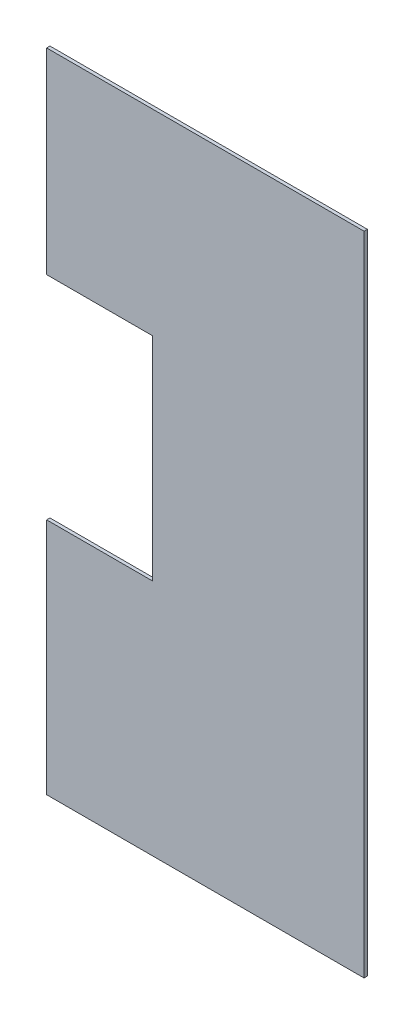
ISO-10303-21;
HEADER;
FILE_DESCRIPTION(('STEP AP214'),'2;1');
FILE_NAME('part.step','',(''),(''),'','','');
FILE_SCHEMA(('AUTOMOTIVE_DESIGN { 1 0 10303 214 1 1 1 1 }'));
ENDSEC;
DATA;
#1=APPLICATION_CONTEXT('core data for automotive mechanical design processes');
#2=APPLICATION_PROTOCOL_DEFINITION('international standard','automotive_design',2000,#1);
#3=PRODUCT_CONTEXT('',#1,'mechanical');
#4=PRODUCT('Part','Part','',(#3));
#5=PRODUCT_RELATED_PRODUCT_CATEGORY('part','',(#4));
#6=PRODUCT_DEFINITION_FORMATION('','',#4);
#7=PRODUCT_DEFINITION_CONTEXT('part definition',#1,'design');
#8=PRODUCT_DEFINITION('design','',#6,#7);
#9=PRODUCT_DEFINITION_SHAPE('','',#8);
#10=(LENGTH_UNIT() NAMED_UNIT(*) SI_UNIT(.MILLI.,.METRE.));
#11=(NAMED_UNIT(*) PLANE_ANGLE_UNIT() SI_UNIT($,.RADIAN.));
#12=(NAMED_UNIT(*) SI_UNIT($,.STERADIAN.) SOLID_ANGLE_UNIT());
#13=UNCERTAINTY_MEASURE_WITH_UNIT(LENGTH_MEASURE(1.E-05),#10,'distance_accuracy_value','');
#14=(GEOMETRIC_REPRESENTATION_CONTEXT(3) GLOBAL_UNCERTAINTY_ASSIGNED_CONTEXT((#13)) GLOBAL_UNIT_ASSIGNED_CONTEXT((#10,
#11,#12)) REPRESENTATION_CONTEXT('',''));
#15=CARTESIAN_POINT('',(0.,0.,0.));
#16=DIRECTION('',(0.,0.,1.));
#17=DIRECTION('',(1.,0.,0.));
#18=AXIS2_PLACEMENT_3D('',#15,#16,#17);
#19=CARTESIAN_POINT('',(-1200.,-1.46957615897682E-13,-12.5));
#20=DIRECTION('',(-1.,0.,0.));
#21=DIRECTION('',(0.,0.,1.));
#22=AXIS2_PLACEMENT_3D('',#19,#20,#21);
#23=PLANE('',#22);
#24=DIRECTION('',(0.,0.,1.));
#25=VECTOR('',#24,1.);
#26=CARTESIAN_POINT('',(-1200.,900.000000000002,-12.5));
#27=LINE('',#26,#25);
#28=CARTESIAN_POINT('',(-1200.,900.000000000002,-12.5));
#29=VERTEX_POINT('',#28);
#30=CARTESIAN_POINT('',(-1200.,900.000000000002,0.));
#31=VERTEX_POINT('',#30);
#32=EDGE_CURVE('E138',#29,#31,#27,.T.);
#33=ORIENTED_EDGE('',*,*,#32,.F.);
#34=DIRECTION('',(0.,-1.,0.));
#35=VECTOR('',#34,1.);
#36=CARTESIAN_POINT('',(-1200.,-1.46957615897682E-13,-12.5));
#37=LINE('',#36,#35);
#38=CARTESIAN_POINT('',(-1200.,-1.46957615897682E-13,-12.5));
#39=VERTEX_POINT('',#38);
#40=EDGE_CURVE('E146',#29,#39,#37,.T.);
#41=ORIENTED_EDGE('',*,*,#40,.T.);
#42=DIRECTION('',(0.,0.,1.));
#43=VECTOR('',#42,1.);
#44=CARTESIAN_POINT('',(-1200.,-1.46957615897682E-13,-12.5));
#45=LINE('',#44,#43);
#46=CARTESIAN_POINT('',(-1200.,-1.46957615897682E-13,0.));
#47=VERTEX_POINT('',#46);
#48=EDGE_CURVE('E43',#39,#47,#45,.T.);
#49=ORIENTED_EDGE('',*,*,#48,.T.);
#50=DIRECTION('',(0.,-1.,0.));
#51=VECTOR('',#50,1.);
#52=CARTESIAN_POINT('',(-1200.,-1.46957615897682E-13,0.));
#53=LINE('',#52,#51);
#54=EDGE_CURVE('E156',#31,#47,#53,.T.);
#55=ORIENTED_EDGE('',*,*,#54,.F.);
#56=EDGE_LOOP('',(#33,#41,#49,#55));
#57=FACE_BOUND('',#56,.T.);
#58=ADVANCED_FACE('F34',(#57),#23,.T.);
#59=CARTESIAN_POINT('',(0.,0.,-12.5));
#60=DIRECTION('',(1.,0.,0.));
#61=DIRECTION('',(0.,0.,-1.));
#62=AXIS2_PLACEMENT_3D('',#59,#60,#61);
#63=PLANE('',#62);
#64=DIRECTION('',(0.,1.,0.));
#65=VECTOR('',#64,1.);
#66=CARTESIAN_POINT('',(0.,0.,0.));
#67=LINE('',#66,#65);
#68=CARTESIAN_POINT('',(0.,0.,0.));
#69=VERTEX_POINT('',#68);
#70=CARTESIAN_POINT('',(0.,2445.,0.));
#71=VERTEX_POINT('',#70);
#72=EDGE_CURVE('E137',#69,#71,#67,.T.);
#73=ORIENTED_EDGE('',*,*,#72,.F.);
#74=DIRECTION('',(0.,0.,1.));
#75=VECTOR('',#74,1.);
#76=CARTESIAN_POINT('',(0.,0.,-12.5));
#77=LINE('',#76,#75);
#78=CARTESIAN_POINT('',(0.,0.,-12.5));
#79=VERTEX_POINT('',#78);
#80=EDGE_CURVE('E11',#79,#69,#77,.T.);
#81=ORIENTED_EDGE('',*,*,#80,.F.);
#82=DIRECTION('',(0.,1.,0.));
#83=VECTOR('',#82,1.);
#84=CARTESIAN_POINT('',(0.,0.,-12.5));
#85=LINE('',#84,#83);
#86=CARTESIAN_POINT('',(0.,2445.,-12.5));
#87=VERTEX_POINT('',#86);
#88=EDGE_CURVE('E141',#79,#87,#85,.T.);
#89=ORIENTED_EDGE('',*,*,#88,.T.);
#90=DIRECTION('',(0.,0.,1.));
#91=VECTOR('',#90,1.);
#92=CARTESIAN_POINT('',(0.,2445.,-12.5));
#93=LINE('',#92,#91);
#94=EDGE_CURVE('E38',#87,#71,#93,.T.);
#95=ORIENTED_EDGE('',*,*,#94,.T.);
#96=EDGE_LOOP('',(#73,#81,#89,#95));
#97=FACE_BOUND('',#96,.T.);
#98=ADVANCED_FACE('F36',(#97),#63,.T.);
#99=CARTESIAN_POINT('',(0.,0.,-12.5));
#100=DIRECTION('',(0.,-1.,0.));
#101=DIRECTION('',(1.,0.,0.));
#102=AXIS2_PLACEMENT_3D('',#99,#100,#101);
#103=PLANE('',#102);
#104=DIRECTION('',(1.,0.,0.));
#105=VECTOR('',#104,1.);
#106=CARTESIAN_POINT('',(0.,0.,0.));
#107=LINE('',#106,#105);
#108=EDGE_CURVE('E144',#47,#69,#107,.T.);
#109=ORIENTED_EDGE('',*,*,#108,.F.);
#110=ORIENTED_EDGE('',*,*,#48,.F.);
#111=DIRECTION('',(1.,0.,0.));
#112=VECTOR('',#111,1.);
#113=CARTESIAN_POINT('',(0.,0.,-12.5));
#114=LINE('',#113,#112);
#115=EDGE_CURVE('E149',#39,#79,#114,.T.);
#116=ORIENTED_EDGE('',*,*,#115,.T.);
#117=ORIENTED_EDGE('',*,*,#80,.T.);
#118=EDGE_LOOP('',(#109,#110,#116,#117));
#119=FACE_BOUND('',#118,.T.);
#120=ADVANCED_FACE('F171',(#119),#103,.T.);
#121=DIRECTION('',(0.,0.,1.));
#122=VECTOR('',#121,1.);
#123=CARTESIAN_POINT('',(-1200.,1702.75,-12.5));
#124=LINE('',#123,#122);
#125=CARTESIAN_POINT('',(-1200.,1702.75,-12.5));
#126=VERTEX_POINT('',#125);
#127=CARTESIAN_POINT('',(-1200.,1702.75,0.));
#128=VERTEX_POINT('',#127);
#129=EDGE_CURVE('E113',#126,#128,#124,.T.);
#130=ORIENTED_EDGE('',*,*,#129,.T.);
#131=CARTESIAN_POINT('',(-1200.,2445.,0.));
#132=VERTEX_POINT('',#131);
#133=EDGE_CURVE('E157',#132,#128,#53,.T.);
#134=ORIENTED_EDGE('',*,*,#133,.F.);
#135=DIRECTION('',(0.,0.,1.));
#136=VECTOR('',#135,1.);
#137=CARTESIAN_POINT('',(-1200.,2445.,-12.5));
#138=LINE('',#137,#136);
#139=CARTESIAN_POINT('',(-1200.,2445.,-12.5));
#140=VERTEX_POINT('',#139);
#141=EDGE_CURVE('E163',#140,#132,#138,.T.);
#142=ORIENTED_EDGE('',*,*,#141,.F.);
#143=EDGE_CURVE('E147',#140,#126,#37,.T.);
#144=ORIENTED_EDGE('',*,*,#143,.T.);
#145=EDGE_LOOP('',(#130,#134,#142,#144));
#146=FACE_BOUND('',#145,.T.);
#147=ADVANCED_FACE('F175',(#146),#23,.T.);
#148=CARTESIAN_POINT('',(0.,2445.,-12.5));
#149=DIRECTION('',(0.,1.,0.));
#150=DIRECTION('',(0.,0.,1.));
#151=AXIS2_PLACEMENT_3D('',#148,#149,#150);
#152=PLANE('',#151);
#153=DIRECTION('',(-1.,0.,0.));
#154=VECTOR('',#153,1.);
#155=CARTESIAN_POINT('',(0.,2445.,0.));
#156=LINE('',#155,#154);
#157=EDGE_CURVE('E153',#71,#132,#156,.T.);
#158=ORIENTED_EDGE('',*,*,#157,.F.);
#159=ORIENTED_EDGE('',*,*,#94,.F.);
#160=DIRECTION('',(-1.,0.,0.));
#161=VECTOR('',#160,1.);
#162=CARTESIAN_POINT('',(0.,2445.,-12.5));
#163=LINE('',#162,#161);
#164=EDGE_CURVE('E143',#87,#140,#163,.T.);
#165=ORIENTED_EDGE('',*,*,#164,.T.);
#166=ORIENTED_EDGE('',*,*,#141,.T.);
#167=EDGE_LOOP('',(#158,#159,#165,#166));
#168=FACE_BOUND('',#167,.T.);
#169=ADVANCED_FACE('F165',(#168),#152,.T.);
#170=CARTESIAN_POINT('',(0.,0.,-12.5));
#171=DIRECTION('',(0.,0.,1.));
#172=DIRECTION('',(1.,0.,0.));
#173=AXIS2_PLACEMENT_3D('',#170,#171,#172);
#174=PLANE('',#173);
#175=ORIENTED_EDGE('',*,*,#40,.F.);
#176=DIRECTION('',(1.,0.,0.));
#177=VECTOR('',#176,1.);
#178=CARTESIAN_POINT('',(-800.,900.000000000002,-12.5));
#179=LINE('',#178,#177);
#180=CARTESIAN_POINT('',(-800.,900.000000000002,-12.5));
#181=VERTEX_POINT('',#180);
#182=EDGE_CURVE('E114',#29,#181,#179,.T.);
#183=ORIENTED_EDGE('',*,*,#182,.T.);
#184=DIRECTION('',(0.,1.,0.));
#185=VECTOR('',#184,1.);
#186=CARTESIAN_POINT('',(-800.,1702.75,-12.5));
#187=LINE('',#186,#185);
#188=CARTESIAN_POINT('',(-800.,1702.75,-12.5));
#189=VERTEX_POINT('',#188);
#190=EDGE_CURVE('E109',#181,#189,#187,.T.);
#191=ORIENTED_EDGE('',*,*,#190,.T.);
#192=DIRECTION('',(-1.,0.,0.));
#193=VECTOR('',#192,1.);
#194=CARTESIAN_POINT('',(-800.,1702.75,-12.5));
#195=LINE('',#194,#193);
#196=EDGE_CURVE('E117',#189,#126,#195,.T.);
#197=ORIENTED_EDGE('',*,*,#196,.T.);
#198=ORIENTED_EDGE('',*,*,#143,.F.);
#199=ORIENTED_EDGE('',*,*,#164,.F.);
#200=ORIENTED_EDGE('',*,*,#88,.F.);
#201=ORIENTED_EDGE('',*,*,#115,.F.);
#202=EDGE_LOOP('',(#175,#183,#191,#197,#198,#199,#200,#201));
#203=FACE_BOUND('',#202,.T.);
#204=ADVANCED_FACE('F125',(#203),#174,.F.);
#205=CARTESIAN_POINT('',(0.,0.,0.));
#206=DIRECTION('',(0.,0.,1.));
#207=DIRECTION('',(1.,0.,0.));
#208=AXIS2_PLACEMENT_3D('',#205,#206,#207);
#209=PLANE('',#208);
#210=DIRECTION('',(1.,0.,0.));
#211=VECTOR('',#210,1.);
#212=CARTESIAN_POINT('',(-800.,900.000000000002,0.));
#213=LINE('',#212,#211);
#214=CARTESIAN_POINT('',(-800.,900.000000000002,0.));
#215=VERTEX_POINT('',#214);
#216=EDGE_CURVE('E126',#31,#215,#213,.T.);
#217=ORIENTED_EDGE('',*,*,#216,.F.);
#218=ORIENTED_EDGE('',*,*,#54,.T.);
#219=ORIENTED_EDGE('',*,*,#108,.T.);
#220=ORIENTED_EDGE('',*,*,#72,.T.);
#221=ORIENTED_EDGE('',*,*,#157,.T.);
#222=ORIENTED_EDGE('',*,*,#133,.T.);
#223=DIRECTION('',(-1.,0.,0.));
#224=VECTOR('',#223,1.);
#225=CARTESIAN_POINT('',(-800.,1702.75,0.));
#226=LINE('',#225,#224);
#227=CARTESIAN_POINT('',(-800.,1702.75,0.));
#228=VERTEX_POINT('',#227);
#229=EDGE_CURVE('E129',#228,#128,#226,.T.);
#230=ORIENTED_EDGE('',*,*,#229,.F.);
#231=DIRECTION('',(0.,1.,0.));
#232=VECTOR('',#231,1.);
#233=CARTESIAN_POINT('',(-800.,1702.75,0.));
#234=LINE('',#233,#232);
#235=EDGE_CURVE('E51',#215,#228,#234,.T.);
#236=ORIENTED_EDGE('',*,*,#235,.F.);
#237=EDGE_LOOP('',(#217,#218,#219,#220,#221,#222,#230,#236));
#238=FACE_BOUND('',#237,.T.);
#239=ADVANCED_FACE('F168',(#238),#209,.T.);
#240=CARTESIAN_POINT('',(-800.,1702.75,-12.5));
#241=DIRECTION('',(1.,0.,0.));
#242=DIRECTION('',(0.,1.,0.));
#243=AXIS2_PLACEMENT_3D('',#240,#241,#242);
#244=PLANE('',#243);
#245=ORIENTED_EDGE('',*,*,#235,.T.);
#246=DIRECTION('',(0.,0.,1.));
#247=VECTOR('',#246,1.);
#248=CARTESIAN_POINT('',(-800.,1702.75,-12.5));
#249=LINE('',#248,#247);
#250=EDGE_CURVE('E105',#189,#228,#249,.T.);
#251=ORIENTED_EDGE('',*,*,#250,.F.);
#252=ORIENTED_EDGE('',*,*,#190,.F.);
#253=DIRECTION('',(0.,0.,1.));
#254=VECTOR('',#253,1.);
#255=CARTESIAN_POINT('',(-800.,900.000000000002,-12.5));
#256=LINE('',#255,#254);
#257=EDGE_CURVE('E135',#181,#215,#256,.T.);
#258=ORIENTED_EDGE('',*,*,#257,.T.);
#259=EDGE_LOOP('',(#245,#251,#252,#258));
#260=FACE_BOUND('',#259,.T.);
#261=ADVANCED_FACE('F107',(#260),#244,.F.);
#262=CARTESIAN_POINT('',(-800.,900.000000000002,-12.5));
#263=DIRECTION('',(0.,-1.,0.));
#264=DIRECTION('',(1.,0.,0.));
#265=AXIS2_PLACEMENT_3D('',#262,#263,#264);
#266=PLANE('',#265);
#267=ORIENTED_EDGE('',*,*,#216,.T.);
#268=ORIENTED_EDGE('',*,*,#257,.F.);
#269=ORIENTED_EDGE('',*,*,#182,.F.);
#270=ORIENTED_EDGE('',*,*,#32,.T.);
#271=EDGE_LOOP('',(#267,#268,#269,#270));
#272=FACE_BOUND('',#271,.T.);
#273=ADVANCED_FACE('F178',(#272),#266,.F.);
#274=CARTESIAN_POINT('',(-800.,1702.75,-12.5));
#275=DIRECTION('',(0.,1.,0.));
#276=DIRECTION('',(0.,0.,1.));
#277=AXIS2_PLACEMENT_3D('',#274,#275,#276);
#278=PLANE('',#277);
#279=ORIENTED_EDGE('',*,*,#229,.T.);
#280=ORIENTED_EDGE('',*,*,#129,.F.);
#281=ORIENTED_EDGE('',*,*,#196,.F.);
#282=ORIENTED_EDGE('',*,*,#250,.T.);
#283=EDGE_LOOP('',(#279,#280,#281,#282));
#284=FACE_BOUND('',#283,.T.);
#285=ADVANCED_FACE('F118',(#284),#278,.F.);
#286=CLOSED_SHELL('',(#58,#98,#120,#147,#169,#204,#239,#261,#273,#285));
#287=MANIFOLD_SOLID_BREP('B2',#286);
#288=ADVANCED_BREP_SHAPE_REPRESENTATION('',(#18,#287),#14);
#289=SHAPE_DEFINITION_REPRESENTATION(#9,#288);
ENDSEC;
END-ISO-10303-21;
